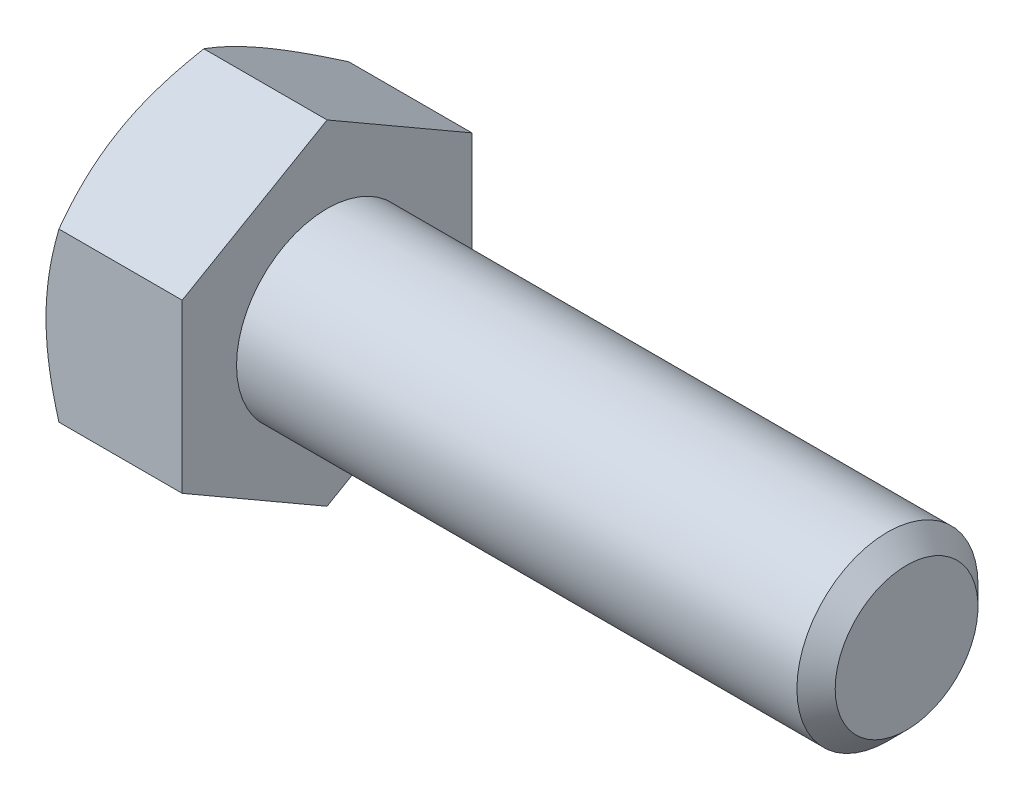
ISO-10303-21;
HEADER;
FILE_DESCRIPTION(('STEP AP214'),'2;1');
FILE_NAME('part.step','',(''),(''),'','','');
FILE_SCHEMA(('AUTOMOTIVE_DESIGN { 1 0 10303 214 1 1 1 1 }'));
ENDSEC;
DATA;
#1=APPLICATION_CONTEXT('core data for automotive mechanical design processes');
#2=APPLICATION_PROTOCOL_DEFINITION('international standard','automotive_design',2000,#1);
#3=PRODUCT_CONTEXT('',#1,'mechanical');
#4=PRODUCT('Part','Part','',(#3));
#5=PRODUCT_RELATED_PRODUCT_CATEGORY('part','',(#4));
#6=PRODUCT_DEFINITION_FORMATION('','',#4);
#7=PRODUCT_DEFINITION_CONTEXT('part definition',#1,'design');
#8=PRODUCT_DEFINITION('design','',#6,#7);
#9=PRODUCT_DEFINITION_SHAPE('','',#8);
#10=(LENGTH_UNIT() NAMED_UNIT(*) SI_UNIT(.MILLI.,.METRE.));
#11=(NAMED_UNIT(*) PLANE_ANGLE_UNIT() SI_UNIT($,.RADIAN.));
#12=(NAMED_UNIT(*) SI_UNIT($,.STERADIAN.) SOLID_ANGLE_UNIT());
#13=UNCERTAINTY_MEASURE_WITH_UNIT(LENGTH_MEASURE(1.E-05),#10,'distance_accuracy_value','');
#14=(GEOMETRIC_REPRESENTATION_CONTEXT(3) GLOBAL_UNCERTAINTY_ASSIGNED_CONTEXT((#13)) GLOBAL_UNIT_ASSIGNED_CONTEXT((#10,
#11,#12)) REPRESENTATION_CONTEXT('',''));
#15=CARTESIAN_POINT('',(0.,0.,0.));
#16=DIRECTION('',(0.,0.,1.));
#17=DIRECTION('',(1.,0.,0.));
#18=AXIS2_PLACEMENT_3D('',#15,#16,#17);
#19=CARTESIAN_POINT('',(5.969,3.66617420935412,-6.35));
#20=DIRECTION('',(0.,-0.866025403784438,0.500000000000001));
#21=DIRECTION('',(0.,-0.500000000000001,-0.866025403784438));
#22=AXIS2_PLACEMENT_3D('',#19,#20,#21);
#23=PLANE('',#22);
#24=CARTESIAN_POINT('',(0.567225792220654,7.33246388876209,0.000200000000000238));
#25=CARTESIAN_POINT('',(0.520705795885485,7.25187715009445,-0.139380325788619));
#26=CARTESIAN_POINT('',(0.476297032585866,7.17098994497989,-0.279481074729295));
#27=CARTESIAN_POINT('',(0.392283450452391,7.00855864282176,-0.560820342806734));
#28=CARTESIAN_POINT('',(0.352680703976119,6.92701427845871,-0.70205932495446));
#29=CARTESIAN_POINT('',(0.241858823809872,6.68107555195827,-1.12803769480199));
#30=CARTESIAN_POINT('',(0.178824482202447,6.51571038378533,-1.41445856787971));
#31=CARTESIAN_POINT('',(0.104909071695575,6.26824441683674,-1.84308219577883));
#32=CARTESIAN_POINT('',(0.0838526679332034,6.18688302502749,-1.98400426016695));
#33=CARTESIAN_POINT('',(0.0485440446617523,6.02379260806586,-2.26648514857209));
#34=CARTESIAN_POINT('',(0.0342912239672212,5.94206361604021,-2.40804391521192));
#35=CARTESIAN_POINT('',(0.012953004278083,5.77846368249352,-2.69140731222966));
#36=CARTESIAN_POINT('',(0.00585947102329016,5.69659300817866,-2.83321147979293));
#37=CARTESIAN_POINT('',(-0.00101567917148112,5.53278054688489,-3.11694298566665));
#38=CARTESIAN_POINT('',(-0.000797521989078327,5.45083876218097,-3.2588703200367));
#39=CARTESIAN_POINT('',(0.00985057652705685,5.22634399461133,-3.64770666350069));
#40=CARTESIAN_POINT('',(0.0277266404085344,5.08386449580427,-3.89448839447147));
#41=CARTESIAN_POINT('',(0.0844122058574271,4.79985183690218,-4.38641274968262));
#42=CARTESIAN_POINT('',(0.123241082865867,4.65831967566048,-4.63155364385826));
#43=CARTESIAN_POINT('',(0.220302170250008,4.37373542545027,-5.12446802425625));
#44=CARTESIAN_POINT('',(0.278945624959319,4.23071924628532,-5.37217931287431));
#45=CARTESIAN_POINT('',(0.412042668710683,3.94681968285054,-5.86390778098996));
#46=CARTESIAN_POINT('',(0.486464993107679,3.80593266266769,-6.10793125807364));
#47=CARTESIAN_POINT('',(0.567225792220648,3.66605873930028,-6.3502));
#48=B_SPLINE_CURVE_WITH_KNOTS('',3,(#24,#25,#26,#27,#28,#29,#30,#31,#32,#33,#34,#35,#36,#37,#38,
#39,#40,#41,#42,#43,#44,#45,#46,#47),.UNSPECIFIED.,.F.,.F.,(4,2,2,2,2,2,2,2,2,2,2,4),(0.,
0.503218195050232,1.00665261286994,2.01561339063536,2.50773694105499,2.99981699787609,
3.49133733019735,3.9828424781586,4.83850206575152,5.69495425638523,6.57040160519864,
7.44413026658513),.UNSPECIFIED.);
#49=CARTESIAN_POINT('',(0.567159123979209,7.33234841870825,0.));
#50=VERTEX_POINT('',#49);
#51=CARTESIAN_POINT('',(0.,5.49926131403118,-3.17500000000001));
#52=VERTEX_POINT('',#51);
#53=EDGE_CURVE('E48',#50,#52,#48,.T.);
#54=ORIENTED_EDGE('',*,*,#53,.F.);
#55=DIRECTION('',(-1.,0.,0.));
#56=VECTOR('',#55,1.);
#57=CARTESIAN_POINT('',(5.969,7.33234841870825,0.));
#58=LINE('',#57,#56);
#59=CARTESIAN_POINT('',(5.969,7.33234841870825,0.));
#60=VERTEX_POINT('',#59);
#61=EDGE_CURVE('E144',#60,#50,#58,.T.);
#62=ORIENTED_EDGE('',*,*,#61,.F.);
#63=DIRECTION('',(0.,0.500000000000001,0.866025403784438));
#64=VECTOR('',#63,1.);
#65=CARTESIAN_POINT('',(5.969,3.66617420935412,-6.35));
#66=LINE('',#65,#64);
#67=CARTESIAN_POINT('',(5.969,3.66617420935412,-6.35));
#68=VERTEX_POINT('',#67);
#69=EDGE_CURVE('E229',#68,#60,#66,.T.);
#70=ORIENTED_EDGE('',*,*,#69,.F.);
#71=DIRECTION('',(-1.,0.,0.));
#72=VECTOR('',#71,1.);
#73=CARTESIAN_POINT('',(5.969,3.66617420935412,-6.35));
#74=LINE('',#73,#72);
#75=CARTESIAN_POINT('',(0.567159123979204,3.66617420935412,-6.35));
#76=VERTEX_POINT('',#75);
#77=EDGE_CURVE('E132',#68,#76,#74,.T.);
#78=ORIENTED_EDGE('',*,*,#77,.T.);
#79=EDGE_CURVE('E126',#52,#76,#48,.T.);
#80=ORIENTED_EDGE('',*,*,#79,.F.);
#81=EDGE_LOOP('',(#54,#62,#70,#78,#80));
#82=FACE_BOUND('',#81,.T.);
#83=ADVANCED_FACE('F32',(#82),#23,.F.);
#84=CARTESIAN_POINT('',(5.969,7.33234841870825,0.));
#85=DIRECTION('',(0.,-0.866025403784438,-0.500000000000001));
#86=DIRECTION('',(0.,0.500000000000001,-0.866025403784438));
#87=AXIS2_PLACEMENT_3D('',#84,#85,#86);
#88=PLANE('',#87);
#89=CARTESIAN_POINT('',(0.567225792220651,3.66605873930028,6.3502));
#90=CARTESIAN_POINT('',(0.520705795885481,3.74664547796792,6.21061967421138));
#91=CARTESIAN_POINT('',(0.476297032585863,3.82753268308249,6.07051892527071));
#92=CARTESIAN_POINT('',(0.392283450452387,3.98996398524061,5.78917965719326));
#93=CARTESIAN_POINT('',(0.352680703976116,4.07150834960367,5.64794067504554));
#94=CARTESIAN_POINT('',(0.24185882380987,4.3174470761041,5.22196230519801));
#95=CARTESIAN_POINT('',(0.178824482202446,4.48281224427705,4.93554143212029));
#96=CARTESIAN_POINT('',(0.104909071695574,4.73027821122564,4.50691780422117));
#97=CARTESIAN_POINT('',(0.0838526679332021,4.81163960303488,4.36599573983305));
#98=CARTESIAN_POINT('',(0.0485440446617516,4.97473001999651,4.08351485142791));
#99=CARTESIAN_POINT('',(0.0342912239672211,5.05645901202216,3.94195608478808));
#100=CARTESIAN_POINT('',(0.0129530042780836,5.22005894556885,3.65859268777034));
#101=CARTESIAN_POINT('',(0.00585947102329081,5.30192961988371,3.51678852020707));
#102=CARTESIAN_POINT('',(-0.00101567917148027,5.46574208117748,3.23305701433335));
#103=CARTESIAN_POINT('',(-0.000797521989077335,5.5476838658814,3.0911296799633));
#104=CARTESIAN_POINT('',(0.00985057652705823,5.77217863345104,2.70229333649931));
#105=CARTESIAN_POINT('',(0.027726640408536,5.9146581322581,2.45551160552853));
#106=CARTESIAN_POINT('',(0.0844122058574296,6.19867079116019,1.96358725031738));
#107=CARTESIAN_POINT('',(0.12324108286587,6.34020295240189,1.71844635614174));
#108=CARTESIAN_POINT('',(0.220302170250012,6.6247872026121,1.22553197574375));
#109=CARTESIAN_POINT('',(0.278945624959323,6.76780338177705,0.977820687125687));
#110=CARTESIAN_POINT('',(0.412042668710688,7.05170294521183,0.486092219010035));
#111=CARTESIAN_POINT('',(0.486464993107684,7.19258996539468,0.242068741926357));
#112=CARTESIAN_POINT('',(0.567225792220654,7.33246388876209,-0.000199999999999491));
#113=B_SPLINE_CURVE_WITH_KNOTS('',3,(#89,#90,#91,#92,#93,#94,#95,#96,#97,#98,#99,#100,#101,#102,
#103,#104,#105,#106,#107,#108,#109,#110,#111,#112),.UNSPECIFIED.,.F.,.F.,(4,2,2,2,2,2,2,2,2,2,2,
4),(0.,0.503218195050231,1.00665261286994,2.01561339063536,2.50773694105499,2.99981699787608,
3.49133733019735,3.9828424781586,4.83850206575152,5.69495425638523,6.57040160519864,
7.44413026658513),.UNSPECIFIED.);
#114=CARTESIAN_POINT('',(0.567159123979206,3.66617420935412,6.35));
#115=VERTEX_POINT('',#114);
#116=CARTESIAN_POINT('',(0.,5.49926131403118,3.17500000000001));
#117=VERTEX_POINT('',#116);
#118=EDGE_CURVE('E55',#115,#117,#113,.T.);
#119=ORIENTED_EDGE('',*,*,#118,.F.);
#120=DIRECTION('',(-1.,0.,0.));
#121=VECTOR('',#120,1.);
#122=CARTESIAN_POINT('',(5.969,3.66617420935412,6.35));
#123=LINE('',#122,#121);
#124=CARTESIAN_POINT('',(5.969,3.66617420935412,6.35));
#125=VERTEX_POINT('',#124);
#126=EDGE_CURVE('E142',#125,#115,#123,.T.);
#127=ORIENTED_EDGE('',*,*,#126,.F.);
#128=DIRECTION('',(0.,-0.500000000000001,0.866025403784438));
#129=VECTOR('',#128,1.);
#130=CARTESIAN_POINT('',(5.969,7.33234841870825,0.));
#131=LINE('',#130,#129);
#132=EDGE_CURVE('E227',#60,#125,#131,.T.);
#133=ORIENTED_EDGE('',*,*,#132,.F.);
#134=ORIENTED_EDGE('',*,*,#61,.T.);
#135=EDGE_CURVE('E159',#117,#50,#113,.T.);
#136=ORIENTED_EDGE('',*,*,#135,.F.);
#137=EDGE_LOOP('',(#119,#127,#133,#134,#136));
#138=FACE_BOUND('',#137,.T.);
#139=ADVANCED_FACE('F165',(#138),#88,.F.);
#140=CARTESIAN_POINT('',(5.969,3.66617420935412,6.35));
#141=DIRECTION('',(0.,0.,-1.));
#142=DIRECTION('',(-1.,0.,0.));
#143=AXIS2_PLACEMENT_3D('',#140,#141,#142);
#144=PLANE('',#143);
#145=CARTESIAN_POINT('',(3.14367601755405,-9.9398028319864,6.35));
#146=CARTESIAN_POINT('',(3.00837198029773,-9.66163438687443,6.35));
#147=CARTESIAN_POINT('',(2.87433908027309,-9.38283710730511,6.35));
#148=CARTESIAN_POINT('',(2.60952879037524,-8.82365074911731,6.35));
#149=CARTESIAN_POINT('',(2.4787518963537,-8.54326143593898,6.35));
#150=CARTESIAN_POINT('',(2.22052868772129,-7.97915634696428,6.35));
#151=CARTESIAN_POINT('',(2.09310359186349,-7.695430825227,6.35));
#152=CARTESIAN_POINT('',(1.84334767414879,-7.12575465379769,6.35));
#153=CARTESIAN_POINT('',(1.72101661744909,-6.83980410740554,6.35));
#154=CARTESIAN_POINT('',(1.47885197386771,-6.2557230270762,6.35));
#155=CARTESIAN_POINT('',(1.35923464654653,-5.9575023498181,6.35));
#156=CARTESIAN_POINT('',(1.12883238942456,-5.357606094795,6.35));
#157=CARTESIAN_POINT('',(1.01804843752938,-5.05593013872692,6.35));
#158=CARTESIAN_POINT('',(0.808153098255227,-4.44917964545297,6.35));
#159=CARTESIAN_POINT('',(0.709018875842445,-4.14411308466491,6.35));
#160=CARTESIAN_POINT('',(0.525543834192885,-3.52960171995185,6.35));
#161=CARTESIAN_POINT('',(0.441198453590938,-3.22015829792944,6.35));
#162=CARTESIAN_POINT('',(0.291727586386876,-2.59842911342063,6.35));
#163=CARTESIAN_POINT('',(0.226496888329709,-2.2861690499431,6.35));
#164=CARTESIAN_POINT('',(0.118904571828102,-1.65762730788836,6.35));
#165=CARTESIAN_POINT('',(0.0765405573459599,-1.34134605421932,6.35));
#166=CARTESIAN_POINT('',(0.0329533459299354,-0.867275016888789,6.35));
#167=CARTESIAN_POINT('',(0.0217606490874789,-0.710363798925238,6.35));
#168=CARTESIAN_POINT('',(0.00601970866108292,-0.396201526465925,6.35));
#169=CARTESIAN_POINT('',(0.00147135206033226,-0.238950477796075,6.35));
#170=CARTESIAN_POINT('',(-0.000864873693704435,0.0756024820110117,6.35));
#171=CARTESIAN_POINT('',(0.00134730804231393,0.2329043935222,6.35));
#172=CARTESIAN_POINT('',(0.0124750937047343,0.54727325996561,6.35));
#173=CARTESIAN_POINT('',(0.0213910154873185,0.704340203403035,6.35));
#174=CARTESIAN_POINT('',(0.0504634057547397,1.07899586027898,6.35));
#175=CARTESIAN_POINT('',(0.0736436238822172,1.2963550957377,6.35));
#176=CARTESIAN_POINT('',(0.131599604348194,1.72951065205878,6.35));
#177=CARTESIAN_POINT('',(0.166376861833686,1.94530676772893,6.35));
#178=CARTESIAN_POINT('',(0.286264257854856,2.59006925980297,6.35));
#179=CARTESIAN_POINT('',(0.386910475193507,3.01618787228098,6.35));
#180=CARTESIAN_POINT('',(0.56211678462825,3.65361272982344,6.35));
#181=CARTESIAN_POINT('',(0.625415304913838,3.86820484032541,6.35));
#182=CARTESIAN_POINT('',(0.758751353425599,4.29530575657378,6.35));
#183=CARTESIAN_POINT('',(0.828788931820658,4.50781454679792,6.35));
#184=CARTESIAN_POINT('',(0.974465563814957,4.93081468737568,6.35));
#185=CARTESIAN_POINT('',(1.05010294252176,5.14130661986484,6.35));
#186=CARTESIAN_POINT('',(1.20607264760708,5.56053331579618,6.35));
#187=CARTESIAN_POINT('',(1.28640487799369,5.76926811506532,6.35));
#188=CARTESIAN_POINT('',(1.50347781751132,6.31783828344511,6.35));
#189=CARTESIAN_POINT('',(1.64351404320344,6.65636817400484,6.35));
#190=CARTESIAN_POINT('',(1.93147973510731,7.33006601753896,6.35));
#191=CARTESIAN_POINT('',(2.07940998438119,7.66523363305402,6.35));
#192=CARTESIAN_POINT('',(2.38134633815376,8.33295246114881,6.35));
#193=CARTESIAN_POINT('',(2.53535453751782,8.66550272340177,6.35));
#194=CARTESIAN_POINT('',(2.84803388547348,9.32838207907315,6.35));
#195=CARTESIAN_POINT('',(3.00670486567662,9.65871125217437,6.35));
#196=CARTESIAN_POINT('',(3.32795966755859,10.3180684957328,6.35));
#197=CARTESIAN_POINT('',(3.49054898052716,10.6470938852597,6.35));
#198=CARTESIAN_POINT('',(3.81866781799735,11.3036759425,6.35));
#199=CARTESIAN_POINT('',(3.98419736411603,11.6312325993929,6.35));
#200=CARTESIAN_POINT('',(4.31759864974134,12.2850676249536,6.35));
#201=CARTESIAN_POINT('',(4.485469913239,12.6113462366288,6.35));
#202=CARTESIAN_POINT('',(4.82315890277016,13.2628952011191,6.35));
#203=CARTESIAN_POINT('',(4.99297663652367,13.5881655499287,6.35));
#204=CARTESIAN_POINT('',(5.47018031685674,14.4967378639502,6.35));
#205=CARTESIAN_POINT('',(5.77935148177738,15.0791020152927,6.35));
#206=CARTESIAN_POINT('',(6.40147296847068,16.2418453877031,6.35));
#207=CARTESIAN_POINT('',(6.71442349983112,16.8222244963774,6.35));
#208=CARTESIAN_POINT('',(7.34215184678353,17.9796171047036,6.35));
#209=CARTESIAN_POINT('',(7.65692074956546,18.5566354431591,6.35));
#210=CARTESIAN_POINT('',(8.28862904640648,19.7094283212459,6.35));
#211=CARTESIAN_POINT('',(8.60556827976312,20.2852029489025,6.35));
#212=CARTESIAN_POINT('',(8.92329906980364,20.8605372016132,6.35));
#213=B_SPLINE_CURVE_WITH_KNOTS('',3,(#145,#146,#147,#148,#149,#150,#151,#152,#153,#154,#155,
#156,#157,#158,#159,#160,#161,#162,#163,#164,#165,#166,#167,#168,#169,#170,#171,#172,#173,#174,
#175,#176,#177,#178,#179,#180,#181,#182,#183,#184,#185,#186,#187,#188,#189,#190,#191,#192,#193,
#194,#195,#196,#197,#198,#199,#200,#201,#202,#203,#204,#205,#206,#207,#208,#209,#210,#211,#212),
.UNSPECIFIED.,.F.,.F.,(4,2,2,2,2,2,2,2,2,2,2,2,2,2,2,2,2,2,2,2,2,2,2,2,2,2,2,2,2,2,2,2,2,4),(0.,
0.928000025771649,1.85614052122796,2.78917912474405,3.72217466606164,4.68601414241723,
5.64996017364175,6.61198406033348,7.57371070325733,8.53003982946588,9.48626872926092,
9.95807916799837,10.4298815813894,10.9016875462366,11.3735158830582,12.0289230702765,
12.6844147884824,13.9960635141582,14.6672040909619,15.338349664455,16.0092953039748,
16.6802272299963,17.7791313314936,18.8781446441682,19.9775401158916,21.0768959334804,
22.1778940812193,23.2789003270287,24.379685937715,25.480475915801,27.4584871219283,
29.4366085285952,31.408472007269,33.380191024666),.UNSPECIFIED.);
#214=CARTESIAN_POINT('',(0.567159123979205,-3.66617420935412,6.35));
#215=VERTEX_POINT('',#214);
#216=CARTESIAN_POINT('',(0.,0.,6.35));
#217=VERTEX_POINT('',#216);
#218=EDGE_CURVE('E239',#215,#217,#213,.T.);
#219=ORIENTED_EDGE('',*,*,#218,.F.);
#220=DIRECTION('',(-1.,0.,0.));
#221=VECTOR('',#220,1.);
#222=CARTESIAN_POINT('',(5.969,-3.66617420935412,6.35));
#223=LINE('',#222,#221);
#224=CARTESIAN_POINT('',(5.969,-3.66617420935412,6.35));
#225=VERTEX_POINT('',#224);
#226=EDGE_CURVE('E134',#225,#215,#223,.T.);
#227=ORIENTED_EDGE('',*,*,#226,.F.);
#228=DIRECTION('',(0.,-1.,0.));
#229=VECTOR('',#228,1.);
#230=CARTESIAN_POINT('',(5.969,3.66617420935412,6.35));
#231=LINE('',#230,#229);
#232=EDGE_CURVE('E223',#125,#225,#231,.T.);
#233=ORIENTED_EDGE('',*,*,#232,.F.);
#234=ORIENTED_EDGE('',*,*,#126,.T.);
#235=EDGE_CURVE('E181',#217,#115,#213,.T.);
#236=ORIENTED_EDGE('',*,*,#235,.F.);
#237=EDGE_LOOP('',(#219,#227,#233,#234,#236));
#238=FACE_BOUND('',#237,.T.);
#239=ADVANCED_FACE('F245',(#238),#144,.F.);
#240=CARTESIAN_POINT('',(5.969,-7.33234841870826,0.));
#241=DIRECTION('',(0.,0.866025403784437,-0.500000000000002));
#242=DIRECTION('',(0.,0.500000000000002,0.866025403784438));
#243=AXIS2_PLACEMENT_3D('',#240,#241,#242);
#244=PLANE('',#243);
#245=CARTESIAN_POINT('',(0.56722579222066,-7.3324638887621,-0.000200000000000067));
#246=CARTESIAN_POINT('',(0.52070579588549,-7.25187715009446,0.13938032578862));
#247=CARTESIAN_POINT('',(0.476297032585872,-7.1709899449799,0.279481074729295));
#248=CARTESIAN_POINT('',(0.392283450452396,-7.00855864282177,0.560820342806735));
#249=CARTESIAN_POINT('',(0.352680703976124,-6.92701427845871,0.70205932495446));
#250=CARTESIAN_POINT('',(0.241858823809876,-6.68107555195828,1.12803769480199));
#251=CARTESIAN_POINT('',(0.178824482202451,-6.51571038378533,1.41445856787971));
#252=CARTESIAN_POINT('',(0.104909071695579,-6.26824441683674,1.84308219577883));
#253=CARTESIAN_POINT('',(0.0838526679332074,-6.1868830250275,1.98400426016695));
#254=CARTESIAN_POINT('',(0.0485440446617561,-6.02379260806587,2.26648514857209));
#255=CARTESIAN_POINT('',(0.0342912239672249,-5.94206361604021,2.40804391521192));
#256=CARTESIAN_POINT('',(0.0129530042780866,-5.77846368249353,2.69140731222967));
#257=CARTESIAN_POINT('',(0.00585947102329391,-5.69659300817867,2.83321147979293));
#258=CARTESIAN_POINT('',(-0.00101567917147761,-5.5327805468849,3.11694298566665));
#259=CARTESIAN_POINT('',(-0.000797521989075183,-5.45083876218098,3.2588703200367));
#260=CARTESIAN_POINT('',(0.00985057652705926,-5.22634399461133,3.6477066635007));
#261=CARTESIAN_POINT('',(0.0277266404085366,-5.08386449580427,3.89448839447147));
#262=CARTESIAN_POINT('',(0.0844122058574293,-4.79985183690218,4.38641274968262));
#263=CARTESIAN_POINT('',(0.12324108286587,-4.65831967566049,4.63155364385826));
#264=CARTESIAN_POINT('',(0.22030217025001,-4.37373542545027,5.12446802425625));
#265=CARTESIAN_POINT('',(0.278945624959321,-4.23071924628532,5.37217931287431));
#266=CARTESIAN_POINT('',(0.412042668710685,-3.94681968285055,5.86390778098997));
#267=CARTESIAN_POINT('',(0.486464993107681,-3.8059326626677,6.10793125807364));
#268=CARTESIAN_POINT('',(0.56722579222065,-3.66605873930028,6.3502));
#269=B_SPLINE_CURVE_WITH_KNOTS('',3,(#245,#246,#247,#248,#249,#250,#251,#252,#253,#254,#255,
#256,#257,#258,#259,#260,#261,#262,#263,#264,#265,#266,#267,#268),.UNSPECIFIED.,.F.,.F.,(4,2,2,
2,2,2,2,2,2,2,2,4),(0.,0.503218195050233,1.00665261286994,2.01561339063537,2.507736941055,
2.99981699787609,3.49133733019736,3.98284247815861,4.83850206575153,5.69495425638523,
6.57040160519865,7.44413026658513),.UNSPECIFIED.);
#270=CARTESIAN_POINT('',(0.567159123979215,-7.33234841870826,0.));
#271=VERTEX_POINT('',#270);
#272=CARTESIAN_POINT('',(0.,-5.49926131403118,3.17500000000001));
#273=VERTEX_POINT('',#272);
#274=EDGE_CURVE('E167',#271,#273,#269,.T.);
#275=ORIENTED_EDGE('',*,*,#274,.F.);
#276=DIRECTION('',(-1.,0.,0.));
#277=VECTOR('',#276,1.);
#278=CARTESIAN_POINT('',(5.969,-7.33234841870826,0.));
#279=LINE('',#278,#277);
#280=CARTESIAN_POINT('',(5.969,-7.33234841870826,0.));
#281=VERTEX_POINT('',#280);
#282=EDGE_CURVE('E131',#281,#271,#279,.T.);
#283=ORIENTED_EDGE('',*,*,#282,.F.);
#284=DIRECTION('',(0.,-0.500000000000002,-0.866025403784437));
#285=VECTOR('',#284,1.);
#286=CARTESIAN_POINT('',(5.969,-7.33234841870826,0.));
#287=LINE('',#286,#285);
#288=EDGE_CURVE('E221',#225,#281,#287,.T.);
#289=ORIENTED_EDGE('',*,*,#288,.F.);
#290=ORIENTED_EDGE('',*,*,#226,.T.);
#291=EDGE_CURVE('E169',#273,#215,#269,.T.);
#292=ORIENTED_EDGE('',*,*,#291,.F.);
#293=EDGE_LOOP('',(#275,#283,#289,#290,#292));
#294=FACE_BOUND('',#293,.T.);
#295=ADVANCED_FACE('F217',(#294),#244,.F.);
#296=CARTESIAN_POINT('',(5.969,-3.66617420935413,-6.35));
#297=DIRECTION('',(0.,0.866025403784438,0.500000000000001));
#298=DIRECTION('',(0.,-0.500000000000001,0.866025403784438));
#299=AXIS2_PLACEMENT_3D('',#296,#297,#298);
#300=PLANE('',#299);
#301=CARTESIAN_POINT('',(0.567225792220653,-3.66605873930029,-6.3502));
#302=CARTESIAN_POINT('',(0.520705795885484,-3.74664547796793,-6.21061967421138));
#303=CARTESIAN_POINT('',(0.476297032585866,-3.8275326830825,-6.0705189252707));
#304=CARTESIAN_POINT('',(0.392283450452391,-3.98996398524062,-5.78917965719326));
#305=CARTESIAN_POINT('',(0.352680703976119,-4.07150834960368,-5.64794067504554));
#306=CARTESIAN_POINT('',(0.241858823809873,-4.31744707610411,-5.22196230519801));
#307=CARTESIAN_POINT('',(0.178824482202449,-4.48281224427706,-4.93554143212029));
#308=CARTESIAN_POINT('',(0.104909071695578,-4.73027821122565,-4.50691780422117));
#309=CARTESIAN_POINT('',(0.0838526679332066,-4.81163960303489,-4.36599573983304));
#310=CARTESIAN_POINT('',(0.0485440446617559,-4.97473001999652,-4.08351485142791));
#311=CARTESIAN_POINT('',(0.0342912239672254,-5.05645901202218,-3.94195608478808));
#312=CARTESIAN_POINT('',(0.0129530042780881,-5.22005894556886,-3.65859268777033));
#313=CARTESIAN_POINT('',(0.00585947102329574,-5.30192961988372,-3.51678852020707));
#314=CARTESIAN_POINT('',(-0.00101567917147494,-5.46574208117749,-3.23305701433335));
#315=CARTESIAN_POINT('',(-0.000797521989071981,-5.54768386588141,-3.0911296799633));
#316=CARTESIAN_POINT('',(0.00985057652706365,-5.77217863345105,-2.7022933364993));
#317=CARTESIAN_POINT('',(0.0277266404085415,-5.91465813225811,-2.45551160552853));
#318=CARTESIAN_POINT('',(0.0844122058574355,-6.19867079116021,-1.96358725031737));
#319=CARTESIAN_POINT('',(0.123241082865876,-6.3402029524019,-1.71844635614173));
#320=CARTESIAN_POINT('',(0.220302170250018,-6.62478720261211,-1.22553197574375));
#321=CARTESIAN_POINT('',(0.278945624959329,-6.76780338177706,-0.977820687125686));
#322=CARTESIAN_POINT('',(0.412042668710694,-7.05170294521184,-0.486092219010034));
#323=CARTESIAN_POINT('',(0.48646499310769,-7.19258996539468,-0.242068741926357));
#324=CARTESIAN_POINT('',(0.56722579222066,-7.3324638887621,0.000200000000000091));
#325=B_SPLINE_CURVE_WITH_KNOTS('',3,(#301,#302,#303,#304,#305,#306,#307,#308,#309,#310,#311,
#312,#313,#314,#315,#316,#317,#318,#319,#320,#321,#322,#323,#324),.UNSPECIFIED.,.F.,.F.,(4,2,2,
2,2,2,2,2,2,2,2,4),(0.,0.503218195050233,1.00665261286994,2.01561339063536,2.50773694105499,
2.99981699787609,3.49133733019735,3.9828424781586,4.83850206575152,5.69495425638523,
6.57040160519864,7.44413026658513),.UNSPECIFIED.);
#326=CARTESIAN_POINT('',(0.567159123978885,-3.66617420935462,-6.35));
#327=VERTEX_POINT('',#326);
#328=CARTESIAN_POINT('',(0.,-5.49926131403118,-3.175));
#329=VERTEX_POINT('',#328);
#330=EDGE_CURVE('E108',#327,#329,#325,.T.);
#331=ORIENTED_EDGE('',*,*,#330,.F.);
#332=DIRECTION('',(-1.,0.,0.));
#333=VECTOR('',#332,1.);
#334=CARTESIAN_POINT('',(5.969,-3.66617420935413,-6.35));
#335=LINE('',#334,#333);
#336=CARTESIAN_POINT('',(5.969,-3.66617420935413,-6.35));
#337=VERTEX_POINT('',#336);
#338=EDGE_CURVE('E122',#337,#327,#335,.T.);
#339=ORIENTED_EDGE('',*,*,#338,.F.);
#340=DIRECTION('',(0.,0.500000000000001,-0.866025403784438));
#341=VECTOR('',#340,1.);
#342=CARTESIAN_POINT('',(5.969,-3.66617420935413,-6.35));
#343=LINE('',#342,#341);
#344=EDGE_CURVE('E219',#281,#337,#343,.T.);
#345=ORIENTED_EDGE('',*,*,#344,.F.);
#346=ORIENTED_EDGE('',*,*,#282,.T.);
#347=EDGE_CURVE('E125',#329,#271,#325,.T.);
#348=ORIENTED_EDGE('',*,*,#347,.F.);
#349=EDGE_LOOP('',(#331,#339,#345,#346,#348));
#350=FACE_BOUND('',#349,.T.);
#351=ADVANCED_FACE('F120',(#350),#300,.F.);
#352=CARTESIAN_POINT('',(5.969,3.66617420935412,-6.35));
#353=DIRECTION('',(0.,0.,1.));
#354=DIRECTION('',(1.,0.,0.));
#355=AXIS2_PLACEMENT_3D('',#352,#353,#354);
#356=PLANE('',#355);
#357=CARTESIAN_POINT('',(3.14367601755406,-9.93980283198641,-6.35));
#358=CARTESIAN_POINT('',(3.00837198029774,-9.66163438687444,-6.35));
#359=CARTESIAN_POINT('',(2.8743390802731,-9.38283710730512,-6.35));
#360=CARTESIAN_POINT('',(2.60952879037524,-8.82365074911732,-6.35));
#361=CARTESIAN_POINT('',(2.47875189635371,-8.54326143593899,-6.35));
#362=CARTESIAN_POINT('',(2.2205286877213,-7.97915634696429,-6.35));
#363=CARTESIAN_POINT('',(2.0931035918635,-7.69543082522702,-6.35));
#364=CARTESIAN_POINT('',(1.84334767414879,-7.1257546537977,-6.35));
#365=CARTESIAN_POINT('',(1.7210166174491,-6.83980410740555,-6.35));
#366=CARTESIAN_POINT('',(1.47885197386772,-6.25572302707622,-6.35));
#367=CARTESIAN_POINT('',(1.35923464654654,-5.95750234981811,-6.35));
#368=CARTESIAN_POINT('',(1.12883238942456,-5.35760609479502,-6.35));
#369=CARTESIAN_POINT('',(1.01804843752939,-5.05593013872693,-6.35));
#370=CARTESIAN_POINT('',(0.808153098255231,-4.44917964545298,-6.35));
#371=CARTESIAN_POINT('',(0.709018875842448,-4.14411308466493,-6.35));
#372=CARTESIAN_POINT('',(0.525543834192888,-3.52960171995186,-6.35));
#373=CARTESIAN_POINT('',(0.441198453590941,-3.22015829792945,-6.35));
#374=CARTESIAN_POINT('',(0.291727586386879,-2.59842911342064,-6.35));
#375=CARTESIAN_POINT('',(0.226496888329711,-2.28616904994311,-6.35));
#376=CARTESIAN_POINT('',(0.118904571828103,-1.65762730788838,-6.35));
#377=CARTESIAN_POINT('',(0.0765405573459601,-1.34134605421933,-6.35));
#378=CARTESIAN_POINT('',(0.0329533459299353,-0.867275016888799,-6.35));
#379=CARTESIAN_POINT('',(0.021760649087479,-0.710363798925248,-6.35));
#380=CARTESIAN_POINT('',(0.00601970866108289,-0.396201526465936,-6.35));
#381=CARTESIAN_POINT('',(0.00147135206033198,-0.238950477796086,-6.35));
#382=CARTESIAN_POINT('',(-0.000864873693705157,0.0756024820110004,-6.35));
#383=CARTESIAN_POINT('',(0.00134730804231307,0.232904393522189,-6.35));
#384=CARTESIAN_POINT('',(0.0124750937047332,0.5472732599656,-6.35));
#385=CARTESIAN_POINT('',(0.0213910154873172,0.704340203403026,-6.35));
#386=CARTESIAN_POINT('',(0.0504634057547379,1.07899586027897,-6.35));
#387=CARTESIAN_POINT('',(0.0736436238822148,1.29635509573769,-6.35));
#388=CARTESIAN_POINT('',(0.131599604348191,1.72951065205877,-6.35));
#389=CARTESIAN_POINT('',(0.166376861833684,1.94530676772892,-6.35));
#390=CARTESIAN_POINT('',(0.286264257854854,2.59006925980295,-6.35));
#391=CARTESIAN_POINT('',(0.386910475193503,3.01618787228096,-6.35));
#392=CARTESIAN_POINT('',(0.562116784628246,3.65361272982343,-6.35));
#393=CARTESIAN_POINT('',(0.625415304913833,3.8682048403254,-6.35));
#394=CARTESIAN_POINT('',(0.758751353425594,4.29530575657376,-6.35));
#395=CARTESIAN_POINT('',(0.828788931820652,4.50781454679791,-6.35));
#396=CARTESIAN_POINT('',(0.974465563814951,4.93081468737566,-6.35));
#397=CARTESIAN_POINT('',(1.05010294252175,5.14130661986482,-6.35));
#398=CARTESIAN_POINT('',(1.20607264760708,5.56053331579616,-6.35));
#399=CARTESIAN_POINT('',(1.28640487799369,5.7692681150653,-6.35));
#400=CARTESIAN_POINT('',(1.50347781751131,6.31783828344509,-6.35));
#401=CARTESIAN_POINT('',(1.64351404320344,6.65636817400483,-6.35));
#402=CARTESIAN_POINT('',(1.9314797351073,7.33006601753895,-6.35));
#403=CARTESIAN_POINT('',(2.07940998438118,7.66523363305401,-6.35));
#404=CARTESIAN_POINT('',(2.38134633815376,8.3329524611488,-6.35));
#405=CARTESIAN_POINT('',(2.53535453751782,8.66550272340175,-6.35));
#406=CARTESIAN_POINT('',(2.84803388547347,9.32838207907314,-6.35));
#407=CARTESIAN_POINT('',(3.00670486567662,9.65871125217435,-6.35));
#408=CARTESIAN_POINT('',(3.32795966755858,10.3180684957328,-6.35));
#409=CARTESIAN_POINT('',(3.49054898052716,10.6470938852597,-6.35));
#410=CARTESIAN_POINT('',(3.81866781799734,11.3036759425,-6.35));
#411=CARTESIAN_POINT('',(3.98419736411603,11.6312325993928,-6.35));
#412=CARTESIAN_POINT('',(4.31759864974134,12.2850676249535,-6.35));
#413=CARTESIAN_POINT('',(4.485469913239,12.6113462366288,-6.35));
#414=CARTESIAN_POINT('',(4.82315890277016,13.2628952011191,-6.35));
#415=CARTESIAN_POINT('',(4.99297663652367,13.5881655499287,-6.35));
#416=CARTESIAN_POINT('',(5.47018031685674,14.4967378639502,-6.35));
#417=CARTESIAN_POINT('',(5.77935148177737,15.0791020152927,-6.35));
#418=CARTESIAN_POINT('',(6.40147296847068,16.2418453877031,-6.35));
#419=CARTESIAN_POINT('',(6.71442349983111,16.8222244963774,-6.35));
#420=CARTESIAN_POINT('',(7.34215184678352,17.9796171047036,-6.35));
#421=CARTESIAN_POINT('',(7.65692074956546,18.5566354431591,-6.35));
#422=CARTESIAN_POINT('',(8.28862904640648,19.7094283212459,-6.35));
#423=CARTESIAN_POINT('',(8.60556827976312,20.2852029489025,-6.35));
#424=CARTESIAN_POINT('',(8.92329906980364,20.8605372016132,-6.35));
#425=B_SPLINE_CURVE_WITH_KNOTS('',3,(#357,#358,#359,#360,#361,#362,#363,#364,#365,#366,#367,
#368,#369,#370,#371,#372,#373,#374,#375,#376,#377,#378,#379,#380,#381,#382,#383,#384,#385,#386,
#387,#388,#389,#390,#391,#392,#393,#394,#395,#396,#397,#398,#399,#400,#401,#402,#403,#404,#405,
#406,#407,#408,#409,#410,#411,#412,#413,#414,#415,#416,#417,#418,#419,#420,#421,#422,#423,#424),
.UNSPECIFIED.,.F.,.F.,(4,2,2,2,2,2,2,2,2,2,2,2,2,2,2,2,2,2,2,2,2,2,2,2,2,2,2,2,2,2,2,2,2,4),(0.,
0.928000025771649,1.85614052122796,2.78917912474405,3.72217466606164,4.68601414241723,
5.64996017364175,6.61198406033348,7.57371070325734,8.53003982946588,9.48626872926093,
9.95807916799838,10.4298815813894,10.9016875462366,11.3735158830582,12.0289230702765,
12.6844147884824,13.9960635141582,14.6672040909619,15.338349664455,16.0092953039748,
16.6802272299963,17.7791313314936,18.8781446441682,19.9775401158916,21.0768959334804,
22.1778940812193,23.2789003270287,24.379685937715,25.480475915801,27.4584871219283,
29.4366085285952,31.408472007269,33.380191024666),.UNSPECIFIED.);
#426=CARTESIAN_POINT('',(0.,0.,-6.35));
#427=VERTEX_POINT('',#426);
#428=EDGE_CURVE('E114',#76,#427,#425,.F.);
#429=ORIENTED_EDGE('',*,*,#428,.F.);
#430=ORIENTED_EDGE('',*,*,#77,.F.);
#431=DIRECTION('',(0.,1.,0.));
#432=VECTOR('',#431,1.);
#433=CARTESIAN_POINT('',(5.969,3.66617420935412,-6.35));
#434=LINE('',#433,#432);
#435=EDGE_CURVE('E130',#337,#68,#434,.T.);
#436=ORIENTED_EDGE('',*,*,#435,.F.);
#437=ORIENTED_EDGE('',*,*,#338,.T.);
#438=EDGE_CURVE('E105',#427,#327,#425,.F.);
#439=ORIENTED_EDGE('',*,*,#438,.F.);
#440=EDGE_LOOP('',(#429,#430,#436,#437,#439));
#441=FACE_BOUND('',#440,.T.);
#442=ADVANCED_FACE('F128',(#441),#356,.F.);
#443=CARTESIAN_POINT('',(5.969,7.33234841870825,0.));
#444=DIRECTION('',(1.,0.,0.));
#445=DIRECTION('',(0.,0.,-1.));
#446=AXIS2_PLACEMENT_3D('',#443,#444,#445);
#447=PLANE('',#446);
#448=ORIENTED_EDGE('',*,*,#69,.T.);
#449=ORIENTED_EDGE('',*,*,#132,.T.);
#450=ORIENTED_EDGE('',*,*,#232,.T.);
#451=ORIENTED_EDGE('',*,*,#288,.T.);
#452=ORIENTED_EDGE('',*,*,#344,.T.);
#453=ORIENTED_EDGE('',*,*,#435,.T.);
#454=EDGE_LOOP('',(#448,#449,#450,#451,#452,#453));
#455=FACE_BOUND('',#454,.T.);
#456=CARTESIAN_POINT('',(5.969,0.,0.));
#457=DIRECTION('',(1.,0.,0.));
#458=DIRECTION('',(0.,0.,-1.));
#459=AXIS2_PLACEMENT_3D('',#456,#457,#458);
#460=CIRCLE('',#459,3.96875);
#461=CARTESIAN_POINT('',(5.969,0.,-3.96875));
#462=VERTEX_POINT('',#461);
#463=EDGE_CURVE('E232',#462,#462,#460,.F.);
#464=ORIENTED_EDGE('',*,*,#463,.T.);
#465=EDGE_LOOP('',(#464));
#466=FACE_BOUND('',#465,.T.);
#467=ADVANCED_FACE('F247',(#455,#466),#447,.T.);
#468=CARTESIAN_POINT('',(0.,0.,0.));
#469=DIRECTION('',(-1.,0.,0.));
#470=DIRECTION('',(0.,0.,1.));
#471=AXIS2_PLACEMENT_3D('',#468,#469,#470);
#472=CYLINDRICAL_SURFACE('',#471,3.96875);
#473=ORIENTED_EDGE('',*,*,#463,.F.);
#474=EDGE_LOOP('',(#473));
#475=FACE_BOUND('',#474,.T.);
#476=CARTESIAN_POINT('',(30.52953,0.,0.));
#477=DIRECTION('',(-1.,0.,0.));
#478=DIRECTION('',(0.,0.,1.));
#479=AXIS2_PLACEMENT_3D('',#476,#477,#478);
#480=CIRCLE('',#479,3.96875);
#481=CARTESIAN_POINT('',(30.52953,0.,3.96875));
#482=VERTEX_POINT('',#481);
#483=EDGE_CURVE('E235',#482,#482,#480,.T.);
#484=ORIENTED_EDGE('',*,*,#483,.T.);
#485=EDGE_LOOP('',(#484));
#486=FACE_BOUND('',#485,.T.);
#487=ADVANCED_FACE('F279',(#475,#486),#472,.T.);
#488=CARTESIAN_POINT('',(31.369,0.,0.));
#489=DIRECTION('',(-1.,0.,0.));
#490=DIRECTION('',(0.,0.,1.));
#491=AXIS2_PLACEMENT_3D('',#488,#489,#490);
#492=CONICAL_SURFACE('',#491,3.12928,0.785398163397441);
#493=ORIENTED_EDGE('',*,*,#483,.F.);
#494=EDGE_LOOP('',(#493));
#495=FACE_BOUND('',#494,.T.);
#496=CARTESIAN_POINT('',(31.369,0.,0.));
#497=DIRECTION('',(-1.,0.,0.));
#498=DIRECTION('',(0.,0.,1.));
#499=AXIS2_PLACEMENT_3D('',#496,#497,#498);
#500=CIRCLE('',#499,3.12928);
#501=CARTESIAN_POINT('',(31.369,0.,3.12928));
#502=VERTEX_POINT('',#501);
#503=EDGE_CURVE('E237',#502,#502,#500,.T.);
#504=ORIENTED_EDGE('',*,*,#503,.T.);
#505=EDGE_LOOP('',(#504));
#506=FACE_BOUND('',#505,.T.);
#507=ADVANCED_FACE('F281',(#495,#506),#492,.T.);
#508=CARTESIAN_POINT('',(31.369,0.,0.));
#509=DIRECTION('',(-1.,0.,0.));
#510=DIRECTION('',(0.,0.,1.));
#511=AXIS2_PLACEMENT_3D('',#508,#509,#510);
#512=PLANE('',#511);
#513=ORIENTED_EDGE('',*,*,#503,.F.);
#514=EDGE_LOOP('',(#513));
#515=FACE_BOUND('',#514,.T.);
#516=ADVANCED_FACE('F194',(#515),#512,.F.);
#517=CARTESIAN_POINT('',(0.,0.,0.));
#518=DIRECTION('',(1.,0.,0.));
#519=DIRECTION('',(0.,0.,-1.));
#520=AXIS2_PLACEMENT_3D('',#517,#518,#519);
#521=CONICAL_SURFACE('',#520,6.35,1.0471975511966);
#522=ORIENTED_EDGE('',*,*,#330,.T.);
#523=CARTESIAN_POINT('',(0.,0.,0.));
#524=DIRECTION('',(1.,0.,0.));
#525=DIRECTION('',(0.,0.,-1.));
#526=AXIS2_PLACEMENT_3D('',#523,#524,#525);
#527=CIRCLE('',#526,6.35);
#528=EDGE_CURVE('E36',#329,#427,#527,.T.);
#529=ORIENTED_EDGE('',*,*,#528,.T.);
#530=ORIENTED_EDGE('',*,*,#438,.T.);
#531=EDGE_LOOP('',(#522,#529,#530));
#532=FACE_BOUND('',#531,.T.);
#533=ADVANCED_FACE('F107',(#532),#521,.T.);
#534=ORIENTED_EDGE('',*,*,#274,.T.);
#535=EDGE_CURVE('E149',#273,#329,#527,.T.);
#536=ORIENTED_EDGE('',*,*,#535,.T.);
#537=ORIENTED_EDGE('',*,*,#347,.T.);
#538=EDGE_LOOP('',(#534,#536,#537));
#539=FACE_BOUND('',#538,.T.);
#540=ADVANCED_FACE('F193',(#539),#521,.T.);
#541=ORIENTED_EDGE('',*,*,#218,.T.);
#542=EDGE_CURVE('E150',#217,#273,#527,.T.);
#543=ORIENTED_EDGE('',*,*,#542,.T.);
#544=ORIENTED_EDGE('',*,*,#291,.T.);
#545=EDGE_LOOP('',(#541,#543,#544));
#546=FACE_BOUND('',#545,.T.);
#547=ADVANCED_FACE('F188',(#546),#521,.T.);
#548=ORIENTED_EDGE('',*,*,#235,.T.);
#549=ORIENTED_EDGE('',*,*,#118,.T.);
#550=CARTESIAN_POINT('',(0.,0.,0.));
#551=DIRECTION('',(-1.,0.,0.));
#552=DIRECTION('',(0.,0.,1.));
#553=AXIS2_PLACEMENT_3D('',#550,#551,#552);
#554=CIRCLE('',#553,6.35);
#555=EDGE_CURVE('E115',#217,#117,#554,.T.);
#556=ORIENTED_EDGE('',*,*,#555,.F.);
#557=EDGE_LOOP('',(#548,#549,#556));
#558=FACE_BOUND('',#557,.T.);
#559=ADVANCED_FACE('F192',(#558),#521,.T.);
#560=ORIENTED_EDGE('',*,*,#135,.T.);
#561=ORIENTED_EDGE('',*,*,#53,.T.);
#562=EDGE_CURVE('E41',#52,#117,#527,.T.);
#563=ORIENTED_EDGE('',*,*,#562,.T.);
#564=EDGE_LOOP('',(#560,#561,#563));
#565=FACE_BOUND('',#564,.T.);
#566=ADVANCED_FACE('F158',(#565),#521,.T.);
#567=ORIENTED_EDGE('',*,*,#79,.T.);
#568=ORIENTED_EDGE('',*,*,#428,.T.);
#569=EDGE_CURVE('E11',#427,#52,#527,.T.);
#570=ORIENTED_EDGE('',*,*,#569,.T.);
#571=EDGE_LOOP('',(#567,#568,#570));
#572=FACE_BOUND('',#571,.T.);
#573=ADVANCED_FACE('F251',(#572),#521,.T.);
#574=CARTESIAN_POINT('',(0.,7.33234841870825,0.));
#575=DIRECTION('',(1.,0.,0.));
#576=DIRECTION('',(0.,0.,-1.));
#577=AXIS2_PLACEMENT_3D('',#574,#575,#576);
#578=PLANE('',#577);
#579=ORIENTED_EDGE('',*,*,#569,.F.);
#580=ORIENTED_EDGE('',*,*,#528,.F.);
#581=ORIENTED_EDGE('',*,*,#535,.F.);
#582=ORIENTED_EDGE('',*,*,#542,.F.);
#583=ORIENTED_EDGE('',*,*,#555,.T.);
#584=ORIENTED_EDGE('',*,*,#562,.F.);
#585=EDGE_LOOP('',(#579,#580,#581,#582,#583,#584));
#586=FACE_BOUND('',#585,.T.);
#587=ADVANCED_FACE('F162',(#586),#578,.F.);
#588=CLOSED_SHELL('',(#83,#139,#239,#295,#351,#442,#467,#487,#507,#516,#533,#540,#547,#559,#566,
#573,#587));
#589=MANIFOLD_SOLID_BREP('B2',#588);
#590=ADVANCED_BREP_SHAPE_REPRESENTATION('',(#18,#589),#14);
#591=SHAPE_DEFINITION_REPRESENTATION(#9,#590);
ENDSEC;
END-ISO-10303-21;
